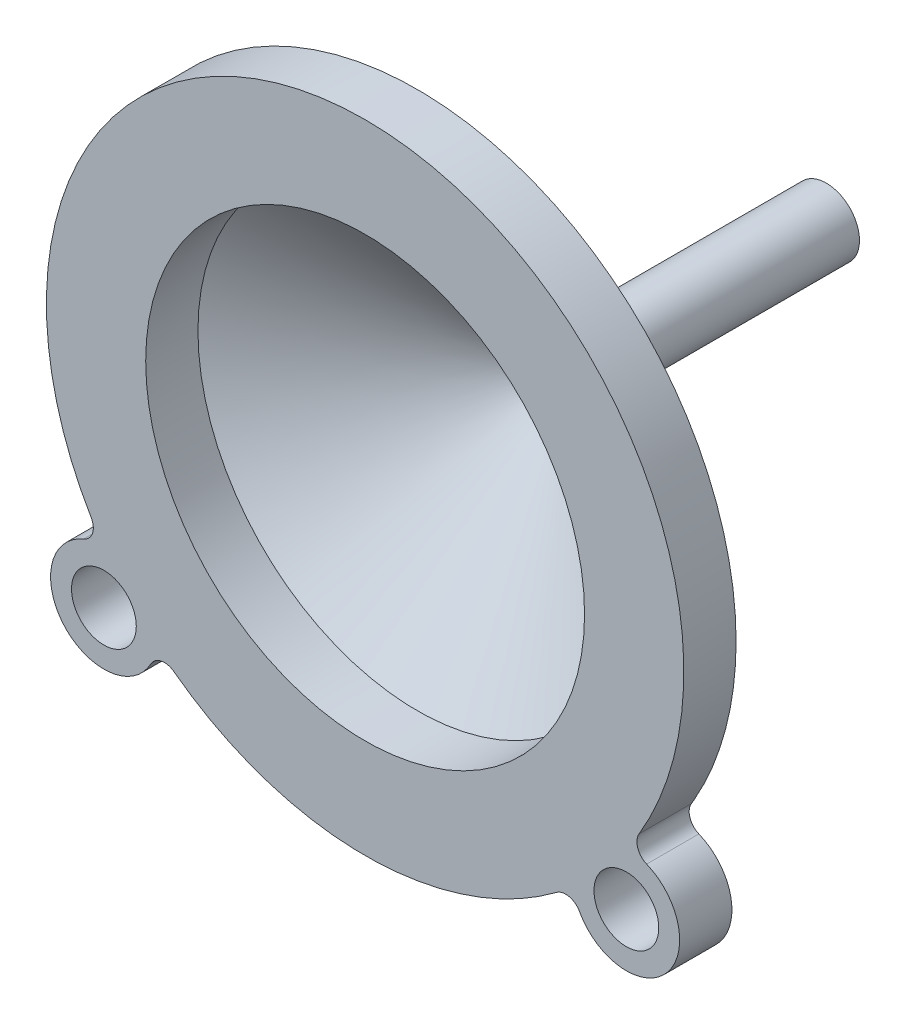
ISO-10303-21;
HEADER;
FILE_DESCRIPTION(('STEP AP214'),'2;1');
FILE_NAME('part.step','',(''),(''),'','','');
FILE_SCHEMA(('AUTOMOTIVE_DESIGN { 1 0 10303 214 1 1 1 1 }'));
ENDSEC;
DATA;
#1=APPLICATION_CONTEXT('core data for automotive mechanical design processes');
#2=APPLICATION_PROTOCOL_DEFINITION('international standard','automotive_design',2000,#1);
#3=PRODUCT_CONTEXT('',#1,'mechanical');
#4=PRODUCT('Part','Part','',(#3));
#5=PRODUCT_RELATED_PRODUCT_CATEGORY('part','',(#4));
#6=PRODUCT_DEFINITION_FORMATION('','',#4);
#7=PRODUCT_DEFINITION_CONTEXT('part definition',#1,'design');
#8=PRODUCT_DEFINITION('design','',#6,#7);
#9=PRODUCT_DEFINITION_SHAPE('','',#8);
#10=(LENGTH_UNIT() NAMED_UNIT(*) SI_UNIT(.MILLI.,.METRE.));
#11=(NAMED_UNIT(*) PLANE_ANGLE_UNIT() SI_UNIT($,.RADIAN.));
#12=(NAMED_UNIT(*) SI_UNIT($,.STERADIAN.) SOLID_ANGLE_UNIT());
#13=UNCERTAINTY_MEASURE_WITH_UNIT(LENGTH_MEASURE(1.E-05),#10,'distance_accuracy_value','');
#14=(GEOMETRIC_REPRESENTATION_CONTEXT(3) GLOBAL_UNCERTAINTY_ASSIGNED_CONTEXT((#13)) GLOBAL_UNIT_ASSIGNED_CONTEXT((#10,
#11,#12)) REPRESENTATION_CONTEXT('',''));
#15=CARTESIAN_POINT('',(0.,0.,0.));
#16=DIRECTION('',(0.,0.,1.));
#17=DIRECTION('',(1.,0.,0.));
#18=AXIS2_PLACEMENT_3D('',#15,#16,#17);
#19=CARTESIAN_POINT('',(0.,0.,0.));
#20=DIRECTION('',(0.,0.,1.));
#21=DIRECTION('',(1.,0.,0.));
#22=AXIS2_PLACEMENT_3D('',#19,#20,#21);
#23=CONICAL_SURFACE('',#22,30.5,0.959931088596887);
#24=CARTESIAN_POINT('',(0.,0.,-19.1331709815801));
#25=DIRECTION('',(0.,0.,1.));
#26=DIRECTION('',(1.,0.,0.));
#27=AXIS2_PLACEMENT_3D('',#24,#25,#26);
#28=CIRCLE('',#27,3.175);
#29=CARTESIAN_POINT('',(3.175,0.,-19.1331709815801));
#30=VERTEX_POINT('',#29);
#31=EDGE_CURVE('E250',#30,#30,#28,.T.);
#32=ORIENTED_EDGE('',*,*,#31,.T.);
#33=EDGE_LOOP('',(#32));
#34=FACE_BOUND('',#33,.T.);
#35=CARTESIAN_POINT('',(0.,0.,0.));
#36=DIRECTION('',(0.,0.,1.));
#37=DIRECTION('',(1.,0.,0.));
#38=AXIS2_PLACEMENT_3D('',#35,#36,#37);
#39=CIRCLE('',#38,30.5);
#40=CARTESIAN_POINT('',(26.4995327627771,-15.1004888448852,0.));
#41=VERTEX_POINT('',#40);
#42=CARTESIAN_POINT('',(-26.4995327627771,-15.1004888448852,0.));
#43=VERTEX_POINT('',#42);
#44=EDGE_CURVE('E168',#41,#43,#39,.T.);
#45=ORIENTED_EDGE('',*,*,#44,.F.);
#46=CARTESIAN_POINT('',(26.4998272637416,-15.1005489462847,0.000200000000201483));
#47=CARTESIAN_POINT('',(26.2850240876564,-15.0567281091826,-0.145650210075096));
#48=CARTESIAN_POINT('',(26.0672601542546,-15.0220758773172,-0.290002327123507));
#49=CARTESIAN_POINT('',(25.6264781094935,-14.9719627147964,-0.574579997651121));
#50=CARTESIAN_POINT('',(25.4034533552258,-14.9565275351551,-0.714799768784477));
#51=CARTESIAN_POINT('',(24.951355155761,-14.945776111692,-0.990831614164049));
#52=CARTESIAN_POINT('',(24.7222451866899,-14.9506437117276,-1.12659214294379));
#53=CARTESIAN_POINT('',(24.261383929305,-14.9819364274957,-1.39052435588818));
#54=CARTESIAN_POINT('',(24.029634242131,-15.0083490968273,-1.51870037571794));
#55=CARTESIAN_POINT('',(23.4393062520521,-15.1043041741347,-1.83217411909519));
#56=CARTESIAN_POINT('',(23.0795560324887,-15.1894033897269,-2.01111453674643));
#57=CARTESIAN_POINT('',(22.5437756836572,-15.3601847540177,-2.25547285967969));
#58=CARTESIAN_POINT('',(22.3660320607247,-15.4241990300531,-2.33283918406021));
#59=CARTESIAN_POINT('',(22.0127733503116,-15.5669969095608,-2.47839059279367));
#60=CARTESIAN_POINT('',(21.837256933656,-15.6457712144711,-2.54658141133876));
#61=CARTESIAN_POINT('',(21.5198864072392,-15.8034110929506,-2.66153468584702));
#62=CARTESIAN_POINT('',(21.3774555981291,-15.8799094608814,-2.70996385489075));
#63=CARTESIAN_POINT('',(21.0960638148033,-16.0431409492395,-2.79879742950449));
#64=CARTESIAN_POINT('',(20.9571011951627,-16.1298691000132,-2.83920570625494));
#65=CARTESIAN_POINT('',(20.6836138107222,-16.3134252639522,-2.91127298238221));
#66=CARTESIAN_POINT('',(20.5490894245904,-16.4102541359885,-2.94293123690217));
#67=CARTESIAN_POINT('',(20.2855993392861,-16.613634019509,-2.9968379366786));
#68=CARTESIAN_POINT('',(20.1566336877854,-16.7201851143467,-3.01908630125001));
#69=CARTESIAN_POINT('',(19.9048571036075,-16.9428856931411,-3.05374375209263));
#70=CARTESIAN_POINT('',(19.7820748158492,-17.0590742348716,-3.06611040123032));
#71=CARTESIAN_POINT('',(19.5443569449105,-17.2998229322145,-3.08054758658992));
#72=CARTESIAN_POINT('',(19.4294213603765,-17.4243830863828,-3.08261812458796));
#73=CARTESIAN_POINT('',(19.208375841638,-17.6808514935558,-3.07641240107073));
#74=CARTESIAN_POINT('',(19.1022657244338,-17.8127595941032,-3.06813635415332));
#75=CARTESIAN_POINT('',(18.8996622938164,-18.0827771527015,-3.04143918758293));
#76=CARTESIAN_POINT('',(18.8031687383776,-18.2208864545562,-3.02301832332675));
#77=CARTESIAN_POINT('',(18.6266879631594,-18.492378906676,-2.97807412708849));
#78=CARTESIAN_POINT('',(18.546020934701,-18.6254293726667,-2.95219849506285));
#79=CARTESIAN_POINT('',(18.3937627311907,-18.8949577009083,-2.89250926617391));
#80=CARTESIAN_POINT('',(18.3221749825849,-19.031436833968,-2.85869268610919));
#81=CARTESIAN_POINT('',(18.1882576489023,-19.3068245885662,-2.78372107001342));
#82=CARTESIAN_POINT('',(18.1259248893079,-19.4457323587088,-2.74256856095855));
#83=CARTESIAN_POINT('',(18.0104639437589,-19.7252211623261,-2.65354762165105));
#84=CARTESIAN_POINT('',(17.9573376679864,-19.8658025365932,-2.60567780139508));
#85=CARTESIAN_POINT('',(17.8432741016564,-20.1970116316961,-2.48614774965496));
#86=CARTESIAN_POINT('',(17.7860496765025,-20.3880349487107,-2.41200479811343));
#87=CARTESIAN_POINT('',(17.6876369317263,-20.7702565082064,-2.25426521334308));
#88=CARTESIAN_POINT('',(17.6464534277319,-20.9614547859717,-2.17066575088984));
#89=CARTESIAN_POINT('',(17.5458072177325,-21.5348541224989,-1.90722857393167));
#90=CARTESIAN_POINT('',(17.5096033951352,-21.9157986785606,-1.71514583207539));
#91=CARTESIAN_POINT('',(17.4971531432438,-22.5042905655387,-1.39641911784766));
#92=CARTESIAN_POINT('',(17.5018083598042,-22.7159043926207,-1.27718986418499));
#93=CARTESIAN_POINT('',(17.5284667904519,-23.1347453243432,-1.03281388349294));
#94=CARTESIAN_POINT('',(17.5504757133285,-23.3419709623765,-0.9076652219137));
#95=CARTESIAN_POINT('',(17.6107109539829,-23.7492208552776,-0.653937611320533));
#96=CARTESIAN_POINT('',(17.6487889628501,-23.9492932560904,-0.525399866926783));
#97=CARTESIAN_POINT('',(17.7403574599677,-24.3433618715242,-0.264926372431859));
#98=CARTESIAN_POINT('',(17.7938343842785,-24.5373632677023,-0.132993705435996));
#99=CARTESIAN_POINT('',(17.85465437173,-24.7280961813345,0.000199999999998498));
#100=B_SPLINE_CURVE_WITH_KNOTS('',3,(#46,#47,#48,#49,#50,#51,#52,#53,#54,#55,#56,#57,#58,#59,
#60,#61,#62,#63,#64,#65,#66,#67,#68,#69,#70,#71,#72,#73,#74,#75,#76,#77,#78,#79,#80,#81,#82,#83,
#84,#85,#86,#87,#88,#89,#90,#91,#92,#93,#94,#95,#96,#97,#98,#99),.UNSPECIFIED.,.F.,.F.,(4,2,2,2,
2,2,2,2,2,2,2,2,2,2,2,2,2,2,2,2,2,2,2,2,2,2,4),(0.,0.789837362021922,1.58073197767573,
2.37880370378232,3.17641471696137,4.40303186612537,5.01488762253738,5.62635920860469,
6.13218537839867,6.63776682091197,7.14339128844774,7.64902009137038,8.15680882480279,
8.66459747063981,9.17237558464,9.68014091585959,10.1528261809695,10.6256893061602,
11.0983898598539,11.5711883734177,12.2084768954693,12.8459565900422,14.1244305395881,
14.8526831001179,15.5811753313992,16.3030861557092,17.0243630290385),.UNSPECIFIED.);
#101=CARTESIAN_POINT('',(17.8545630422115,-24.7278098215692,0.));
#102=VERTEX_POINT('',#101);
#103=EDGE_CURVE('E11',#41,#102,#100,.T.);
#104=ORIENTED_EDGE('',*,*,#103,.T.);
#105=CARTESIAN_POINT('',(0.,0.,0.));
#106=DIRECTION('',(0.,0.,1.));
#107=DIRECTION('',(1.,0.,0.));
#108=AXIS2_PLACEMENT_3D('',#105,#106,#107);
#109=CIRCLE('',#108,30.5);
#110=CARTESIAN_POINT('',(-17.8545630422115,-24.7278098215692,0.));
#111=VERTEX_POINT('',#110);
#112=EDGE_CURVE('E152',#111,#102,#109,.T.);
#113=ORIENTED_EDGE('',*,*,#112,.F.);
#114=CARTESIAN_POINT('',(-17.85465437173,-24.7280961813345,0.000200000000000536));
#115=CARTESIAN_POINT('',(-17.7880562707248,-24.5192293262255,-0.145650210075289));
#116=CARTESIAN_POINT('',(-17.7302564932895,-24.306435779349,-0.290002327123695));
#117=CARTESIAN_POINT('',(-17.6331743009602,-23.8735672219621,-0.574579997651302));
#118=CARTESIAN_POINT('',(-17.5939167764405,-23.6534828459712,-0.714799768784654));
#119=CARTESIAN_POINT('',(-17.5347561949736,-23.2051432418023,-0.990831614164214));
#120=CARTESIAN_POINT('',(-17.5150320063468,-22.9768319896904,-1.12659214294394));
#121=CARTESIAN_POINT('',(-17.4967337015548,-22.5152721293687,-1.39052435588832));
#122=CARTESIAN_POINT('',(-17.4981473823938,-22.2820264474945,-1.51870037571808));
#123=CARTESIAN_POINT('',(-17.5302581152443,-21.6848134088161,-1.83217411909531));
#124=CARTESIAN_POINT('',(-17.5762966598493,-21.3180129870866,-2.01111453674654));
#125=CARTESIAN_POINT('',(-17.6886506362404,-20.7670107724158,-2.25547285967979));
#126=CARTESIAN_POINT('',(-17.7332393790101,-20.5834284555993,-2.33283918406031));
#127=CARTESIAN_POINT('',(-17.8373399911177,-20.216896037615,-2.47839059279375));
#128=CARTESIAN_POINT('',(-17.8968424729848,-20.033945611867,-2.54658141133883));
#129=CARTESIAN_POINT('',(-18.0195472404113,-19.701503252388,-2.66153468584708));
#130=CARTESIAN_POINT('',(-18.0803341348299,-19.5516917403245,-2.70996385489082));
#131=CARTESIAN_POINT('',(-18.2124556969263,-19.254421245078,-2.79879742950455));
#132=CARTESIAN_POINT('',(-18.2837852471834,-19.1069611587695,-2.83920570625499));
#133=CARTESIAN_POINT('',(-18.436961793377,-18.8153704173795,-2.91127298238225));
#134=CARTESIAN_POINT('',(-18.5188096838325,-18.671240046701,-2.94293123690221));
#135=CARTESIAN_POINT('',(-18.6927675332547,-18.3874636052918,-2.99683793667863));
#136=CARTESIAN_POINT('',(-18.7848775802056,-18.2478175730216,-3.01908630125004));
#137=CARTESIAN_POINT('',(-18.9793006083798,-17.9736156724971,-3.05374375209265));
#138=CARTESIAN_POINT('',(-19.0816554933761,-17.8390840965232,-3.06611040123033));
#139=CARTESIAN_POINT('',(-19.2955298976245,-17.5769248688708,-3.08054758658993));
#140=CARTESIAN_POINT('',(-19.4070494152956,-17.4492972160013,-3.08261812458796));
#141=CARTESIAN_POINT('',(-19.6383404258065,-17.2020288725177,-3.07641240107073));
#142=CARTESIAN_POINT('',(-19.7581117474474,-17.0823880163042,-3.06813635415331));
#143=CARTESIAN_POINT('',(-20.0048510568896,-16.8520028057864,-3.04143918758292));
#144=CARTESIAN_POINT('',(-20.1318188634464,-16.7412582275979,-3.02301832332674));
#145=CARTESIAN_POINT('',(-20.3828252721508,-16.5366869726059,-2.97807412708847));
#146=CARTESIAN_POINT('',(-20.5064602228004,-16.4422200738608,-2.95219849506282));
#147=CARTESIAN_POINT('',(-20.7581108208339,-16.2619423526352,-2.89250926617388));
#148=CARTESIAN_POINT('',(-20.8861280990638,-16.1761348006028,-2.85869268610916));
#149=CARTESIAN_POINT('',(-21.1455707425658,-16.0134640214935,-2.78372107001338));
#150=CARTESIAN_POINT('',(-21.2769949209975,-15.9365977294784,-2.74256856095851));
#151=CARTESIAN_POINT('',(-21.5424937530691,-15.7918372671168,-2.65354762165101));
#152=CARTESIAN_POINT('',(-21.6765689503347,-15.7239449594047,-2.60567780139503));
#153=CARTESIAN_POINT('',(-21.9936397762192,-15.5750286969759,-2.48614774965491));
#154=CARTESIAN_POINT('',(-22.1774267909068,-15.4976537933596,-2.41200479811338));
#155=CARTESIAN_POINT('',(-22.5468940279874,-15.3588289050947,-2.25426521334301));
#156=CARTESIAN_POINT('',(-22.7325748017624,-15.2973837045336,-2.17066575088976));
#157=CARTESIAN_POINT('',(-23.2918784085553,-15.1358413443133,-1.90722857393158));
#158=CARTESIAN_POINT('',(-23.6667456527436,-15.0590037181241,-1.7151458320753));
#159=CARTESIAN_POINT('',(-24.2505106331409,-14.9835308258184,-1.39641911784756));
#160=CARTESIAN_POINT('',(-24.4614038206496,-14.965471304343,-1.27718986418488));
#161=CARTESIAN_POINT('',(-24.8806887016342,-14.9470705818424,-1.03281388349281));
#162=CARTESIAN_POINT('',(-25.0890795490169,-14.9467352139414,-0.907665221913559));
#163=CARTESIAN_POINT('',(-25.5004400966251,-14.9629604830039,-0.653937611320374));
#164=CARTESIAN_POINT('',(-25.7034417645324,-14.9793685040039,-0.525399866926614));
#165=CARTESIAN_POINT('',(-26.1050563665392,-15.0281596383334,-0.26492637243167));
#166=CARTESIAN_POINT('',(-26.303672998089,-15.060528710372,-0.132993705435799));
#167=CARTESIAN_POINT('',(-26.4998272637416,-15.1005489462847,0.000200000000201425));
#168=B_SPLINE_CURVE_WITH_KNOTS('',3,(#114,#115,#116,#117,#118,#119,#120,#121,#122,#123,#124,
#125,#126,#127,#128,#129,#130,#131,#132,#133,#134,#135,#136,#137,#138,#139,#140,#141,#142,#143,
#144,#145,#146,#147,#148,#149,#150,#151,#152,#153,#154,#155,#156,#157,#158,#159,#160,#161,#162,
#163,#164,#165,#166,#167),.UNSPECIFIED.,.F.,.F.,(4,2,2,2,2,2,2,2,2,2,2,2,2,2,2,2,2,2,2,2,2,2,2,
2,2,2,4),(0.,0.789837362021904,1.58073197767569,2.37880370378226,3.17641471696128,
4.40303186612525,5.01488762253726,5.62635920860456,6.13218537839853,6.63776682091182,
7.14339128844758,7.64902009137021,8.15680882480263,8.66459747063963,9.17237558463982,
9.68014091585939,10.1528261809693,10.62568930616,11.0983898598537,11.5711883734175,
12.2084768954692,12.8459565900421,14.1244305395879,14.8526831001178,15.5811753313992,
16.3030861557092,17.0243630290385),.UNSPECIFIED.);
#169=EDGE_CURVE('E53',#111,#43,#168,.T.);
#170=ORIENTED_EDGE('',*,*,#169,.T.);
#171=EDGE_LOOP('',(#45,#104,#113,#170));
#172=FACE_BOUND('',#171,.T.);
#173=ADVANCED_FACE('F38',(#34,#172),#23,.T.);
#174=CARTESIAN_POINT('',(9.60025923141054,-12.7998055723404,0.));
#175=DIRECTION('',(0.,0.,1.));
#176=DIRECTION('',(1.,0.,0.));
#177=AXIS2_PLACEMENT_3D('',#174,#175,#176);
#178=PLANE('',#177);
#179=CARTESIAN_POINT('',(-25.,-22.4490534321606,0.));
#180=DIRECTION('',(0.,0.,1.));
#181=DIRECTION('',(1.,0.,0.));
#182=AXIS2_PLACEMENT_3D('',#179,#180,#181);
#183=CIRCLE('',#182,3.1);
#184=CARTESIAN_POINT('',(-21.9,-22.4490534321606,0.));
#185=VERTEX_POINT('',#184);
#186=EDGE_CURVE('E339',#185,#185,#183,.T.);
#187=ORIENTED_EDGE('',*,*,#186,.T.);
#188=EDGE_LOOP('',(#187));
#189=FACE_BOUND('',#188,.T.);
#190=CARTESIAN_POINT('',(-27.5106139067934,-16.3452171130072,0.));
#191=DIRECTION('',(0.,0.,-1.));
#192=DIRECTION('',(1.,0.,0.));
#193=AXIS2_PLACEMENT_3D('',#190,#191,#192);
#194=CIRCLE('',#193,1.5);
#195=CARTESIAN_POINT('',(-26.2210538799125,-15.579035060835,0.));
#196=VERTEX_POINT('',#195);
#197=CARTESIAN_POINT('',(-26.9400198370677,-17.7324526400875,0.));
#198=VERTEX_POINT('',#197);
#199=EDGE_CURVE('E134',#196,#198,#194,.T.);
#200=ORIENTED_EDGE('',*,*,#199,.F.);
#201=EDGE_CURVE('E163',#43,#196,#39,.T.);
#202=ORIENTED_EDGE('',*,*,#201,.F.);
#203=CARTESIAN_POINT('',(-25.,-22.4490534321606,0.));
#204=DIRECTION('',(0.,0.,-1.));
#205=DIRECTION('',(-1.,0.,0.));
#206=AXIS2_PLACEMENT_3D('',#203,#204,#205);
#207=CIRCLE('',#206,7.5);
#208=EDGE_CURVE('E320',#43,#111,#207,.T.);
#209=ORIENTED_EDGE('',*,*,#208,.T.);
#210=CARTESIAN_POINT('',(-18.3004941598763,-24.3996293722739,0.));
#211=VERTEX_POINT('',#210);
#212=EDGE_CURVE('E147',#211,#111,#109,.T.);
#213=ORIENTED_EDGE('',*,*,#212,.F.);
#214=CARTESIAN_POINT('',(-19.2005184628211,-25.5996111446808,0.));
#215=DIRECTION('',(0.,0.,-1.));
#216=DIRECTION('',(1.,0.,0.));
#217=AXIS2_PLACEMENT_3D('',#214,#215,#216);
#218=CIRCLE('',#217,1.5);
#219=CARTESIAN_POINT('',(-20.5185824485436,-24.8835753009262,0.));
#220=VERTEX_POINT('',#219);
#221=EDGE_CURVE('E173',#220,#211,#218,.T.);
#222=ORIENTED_EDGE('',*,*,#221,.F.);
#223=CARTESIAN_POINT('',(-25.,-22.4490534321606,0.));
#224=DIRECTION('',(0.,0.,1.));
#225=DIRECTION('',(1.,0.,0.));
#226=AXIS2_PLACEMENT_3D('',#223,#224,#225);
#227=CIRCLE('',#226,5.1);
#228=EDGE_CURVE('E94',#198,#220,#227,.T.);
#229=ORIENTED_EDGE('',*,*,#228,.F.);
#230=EDGE_LOOP('',(#200,#202,#209,#213,#222,#229));
#231=FACE_BOUND('',#230,.T.);
#232=ADVANCED_FACE('F239',(#189,#231),#178,.F.);
#233=CARTESIAN_POINT('',(9.60025923141054,-12.7998055723404,5.));
#234=DIRECTION('',(0.,0.,1.));
#235=DIRECTION('',(1.,0.,0.));
#236=AXIS2_PLACEMENT_3D('',#233,#234,#235);
#237=PLANE('',#236);
#238=CARTESIAN_POINT('',(25.,-22.4490534321606,5.));
#239=DIRECTION('',(0.,0.,1.));
#240=DIRECTION('',(1.,0.,0.));
#241=AXIS2_PLACEMENT_3D('',#238,#239,#240);
#242=CIRCLE('',#241,3.1);
#243=CARTESIAN_POINT('',(28.1,-22.4490534321606,5.));
#244=VERTEX_POINT('',#243);
#245=EDGE_CURVE('E291',#244,#244,#242,.T.);
#246=ORIENTED_EDGE('',*,*,#245,.F.);
#247=EDGE_LOOP('',(#246));
#248=FACE_BOUND('',#247,.T.);
#249=CARTESIAN_POINT('',(0.,0.,5.));
#250=DIRECTION('',(0.,0.,1.));
#251=DIRECTION('',(1.,0.,0.));
#252=AXIS2_PLACEMENT_3D('',#249,#250,#251);
#253=CIRCLE('',#252,30.5);
#254=CARTESIAN_POINT('',(-18.3004941598763,-24.3996293722739,5.));
#255=VERTEX_POINT('',#254);
#256=CARTESIAN_POINT('',(18.3004941598763,-24.3996293722739,5.));
#257=VERTEX_POINT('',#256);
#258=EDGE_CURVE('E177',#255,#257,#253,.T.);
#259=ORIENTED_EDGE('',*,*,#258,.T.);
#260=CARTESIAN_POINT('',(19.2005184628211,-25.5996111446808,5.));
#261=DIRECTION('',(0.,0.,-1.));
#262=DIRECTION('',(1.,0.,0.));
#263=AXIS2_PLACEMENT_3D('',#260,#261,#262);
#264=CIRCLE('',#263,1.5);
#265=CARTESIAN_POINT('',(20.5185824485436,-24.8835753009262,5.));
#266=VERTEX_POINT('',#265);
#267=EDGE_CURVE('E103',#257,#266,#264,.T.);
#268=ORIENTED_EDGE('',*,*,#267,.T.);
#269=CARTESIAN_POINT('',(25.,-22.4490534321606,5.));
#270=DIRECTION('',(0.,0.,1.));
#271=DIRECTION('',(1.,0.,0.));
#272=AXIS2_PLACEMENT_3D('',#269,#270,#271);
#273=CIRCLE('',#272,5.1);
#274=CARTESIAN_POINT('',(26.9400198370677,-17.7324526400875,5.));
#275=VERTEX_POINT('',#274);
#276=EDGE_CURVE('E274',#266,#275,#273,.T.);
#277=ORIENTED_EDGE('',*,*,#276,.T.);
#278=CARTESIAN_POINT('',(27.5106139067934,-16.3452171130072,5.));
#279=DIRECTION('',(0.,0.,-1.));
#280=DIRECTION('',(1.,0.,0.));
#281=AXIS2_PLACEMENT_3D('',#278,#279,#280);
#282=CIRCLE('',#281,1.5);
#283=CARTESIAN_POINT('',(26.2210538799125,-15.579035060835,5.));
#284=VERTEX_POINT('',#283);
#285=EDGE_CURVE('E270',#275,#284,#282,.T.);
#286=ORIENTED_EDGE('',*,*,#285,.T.);
#287=CARTESIAN_POINT('',(0.,0.,5.));
#288=DIRECTION('',(0.,0.,1.));
#289=DIRECTION('',(1.,0.,0.));
#290=AXIS2_PLACEMENT_3D('',#287,#288,#289);
#291=CIRCLE('',#290,30.5);
#292=CARTESIAN_POINT('',(-26.2210538799125,-15.579035060835,5.));
#293=VERTEX_POINT('',#292);
#294=EDGE_CURVE('E125',#284,#293,#291,.T.);
#295=ORIENTED_EDGE('',*,*,#294,.T.);
#296=CARTESIAN_POINT('',(-27.5106139067934,-16.3452171130072,5.));
#297=DIRECTION('',(0.,0.,-1.));
#298=DIRECTION('',(1.,0.,0.));
#299=AXIS2_PLACEMENT_3D('',#296,#297,#298);
#300=CIRCLE('',#299,1.5);
#301=CARTESIAN_POINT('',(-26.9400198370677,-17.7324526400875,5.));
#302=VERTEX_POINT('',#301);
#303=EDGE_CURVE('E118',#293,#302,#300,.T.);
#304=ORIENTED_EDGE('',*,*,#303,.T.);
#305=CARTESIAN_POINT('',(-25.,-22.4490534321606,5.));
#306=DIRECTION('',(0.,0.,1.));
#307=DIRECTION('',(1.,0.,0.));
#308=AXIS2_PLACEMENT_3D('',#305,#306,#307);
#309=CIRCLE('',#308,5.1);
#310=CARTESIAN_POINT('',(-20.5185824485436,-24.8835753009262,5.));
#311=VERTEX_POINT('',#310);
#312=EDGE_CURVE('E123',#302,#311,#309,.T.);
#313=ORIENTED_EDGE('',*,*,#312,.T.);
#314=CARTESIAN_POINT('',(-19.2005184628211,-25.5996111446808,5.));
#315=DIRECTION('',(0.,0.,-1.));
#316=DIRECTION('',(1.,0.,0.));
#317=AXIS2_PLACEMENT_3D('',#314,#315,#316);
#318=CIRCLE('',#317,1.5);
#319=EDGE_CURVE('E69',#311,#255,#318,.T.);
#320=ORIENTED_EDGE('',*,*,#319,.T.);
#321=EDGE_LOOP('',(#259,#268,#277,#286,#295,#304,#313,#320));
#322=FACE_BOUND('',#321,.T.);
#323=CARTESIAN_POINT('',(0.,0.,5.));
#324=DIRECTION('',(0.,0.,1.));
#325=DIRECTION('',(1.,0.,0.));
#326=AXIS2_PLACEMENT_3D('',#323,#324,#325);
#327=CIRCLE('',#326,21.);
#328=CARTESIAN_POINT('',(21.,0.,5.));
#329=VERTEX_POINT('',#328);
#330=EDGE_CURVE('E281',#329,#329,#327,.T.);
#331=ORIENTED_EDGE('',*,*,#330,.F.);
#332=EDGE_LOOP('',(#331));
#333=FACE_BOUND('',#332,.T.);
#334=CARTESIAN_POINT('',(-25.,-22.4490534321606,5.));
#335=DIRECTION('',(0.,0.,1.));
#336=DIRECTION('',(1.,0.,0.));
#337=AXIS2_PLACEMENT_3D('',#334,#335,#336);
#338=CIRCLE('',#337,3.1);
#339=CARTESIAN_POINT('',(-21.9,-22.4490534321606,5.));
#340=VERTEX_POINT('',#339);
#341=EDGE_CURVE('E340',#340,#340,#338,.T.);
#342=ORIENTED_EDGE('',*,*,#341,.F.);
#343=EDGE_LOOP('',(#342));
#344=FACE_BOUND('',#343,.T.);
#345=ADVANCED_FACE('F120',(#248,#322,#333,#344),#237,.T.);
#346=CARTESIAN_POINT('',(25.,-22.4490534321606,0.));
#347=DIRECTION('',(0.,0.,1.));
#348=DIRECTION('',(1.,0.,0.));
#349=AXIS2_PLACEMENT_3D('',#346,#347,#348);
#350=CIRCLE('',#349,3.1);
#351=CARTESIAN_POINT('',(28.1,-22.4490534321606,0.));
#352=VERTEX_POINT('',#351);
#353=EDGE_CURVE('E294',#352,#352,#350,.T.);
#354=ORIENTED_EDGE('',*,*,#353,.T.);
#355=EDGE_LOOP('',(#354));
#356=FACE_BOUND('',#355,.T.);
#357=CARTESIAN_POINT('',(19.2005184628211,-25.5996111446808,0.));
#358=DIRECTION('',(0.,0.,-1.));
#359=DIRECTION('',(1.,0.,0.));
#360=AXIS2_PLACEMENT_3D('',#357,#358,#359);
#361=CIRCLE('',#360,1.5);
#362=CARTESIAN_POINT('',(18.3004941598763,-24.3996293722739,0.));
#363=VERTEX_POINT('',#362);
#364=CARTESIAN_POINT('',(20.5185824485436,-24.8835753009262,0.));
#365=VERTEX_POINT('',#364);
#366=EDGE_CURVE('E151',#363,#365,#361,.T.);
#367=ORIENTED_EDGE('',*,*,#366,.F.);
#368=EDGE_CURVE('E153',#102,#363,#109,.T.);
#369=ORIENTED_EDGE('',*,*,#368,.F.);
#370=CARTESIAN_POINT('',(25.,-22.4490534321606,0.));
#371=DIRECTION('',(0.,0.,-1.));
#372=DIRECTION('',(-1.,0.,0.));
#373=AXIS2_PLACEMENT_3D('',#370,#371,#372);
#374=CIRCLE('',#373,7.5);
#375=EDGE_CURVE('E60',#102,#41,#374,.T.);
#376=ORIENTED_EDGE('',*,*,#375,.T.);
#377=CARTESIAN_POINT('',(26.2210538799125,-15.579035060835,0.));
#378=VERTEX_POINT('',#377);
#379=EDGE_CURVE('E164',#378,#41,#39,.T.);
#380=ORIENTED_EDGE('',*,*,#379,.F.);
#381=CARTESIAN_POINT('',(27.5106139067934,-16.3452171130072,0.));
#382=DIRECTION('',(0.,0.,-1.));
#383=DIRECTION('',(1.,0.,0.));
#384=AXIS2_PLACEMENT_3D('',#381,#382,#383);
#385=CIRCLE('',#384,1.5);
#386=CARTESIAN_POINT('',(26.9400198370677,-17.7324526400875,0.));
#387=VERTEX_POINT('',#386);
#388=EDGE_CURVE('E159',#387,#378,#385,.T.);
#389=ORIENTED_EDGE('',*,*,#388,.F.);
#390=CARTESIAN_POINT('',(25.,-22.4490534321606,0.));
#391=DIRECTION('',(0.,0.,1.));
#392=DIRECTION('',(1.,0.,0.));
#393=AXIS2_PLACEMENT_3D('',#390,#391,#392);
#394=CIRCLE('',#393,5.1);
#395=EDGE_CURVE('E156',#365,#387,#394,.T.);
#396=ORIENTED_EDGE('',*,*,#395,.F.);
#397=EDGE_LOOP('',(#367,#369,#376,#380,#389,#396));
#398=FACE_BOUND('',#397,.T.);
#399=ADVANCED_FACE('F246',(#356,#398),#178,.F.);
#400=CARTESIAN_POINT('',(0.,0.,5.));
#401=DIRECTION('',(0.,0.,-1.));
#402=DIRECTION('',(-1.,0.,0.));
#403=AXIS2_PLACEMENT_3D('',#400,#401,#402);
#404=CYLINDRICAL_SURFACE('',#403,30.5);
#405=ORIENTED_EDGE('',*,*,#212,.T.);
#406=ORIENTED_EDGE('',*,*,#112,.T.);
#407=ORIENTED_EDGE('',*,*,#368,.T.);
#408=DIRECTION('',(0.,0.,-1.));
#409=VECTOR('',#408,1.);
#410=CARTESIAN_POINT('',(18.3004941598763,-24.3996293722739,5.));
#411=LINE('',#410,#409);
#412=EDGE_CURVE('E197',#257,#363,#411,.T.);
#413=ORIENTED_EDGE('',*,*,#412,.F.);
#414=ORIENTED_EDGE('',*,*,#258,.F.);
#415=DIRECTION('',(0.,0.,-1.));
#416=VECTOR('',#415,1.);
#417=CARTESIAN_POINT('',(-18.3004941598763,-24.3996293722739,5.));
#418=LINE('',#417,#416);
#419=EDGE_CURVE('E143',#255,#211,#418,.T.);
#420=ORIENTED_EDGE('',*,*,#419,.T.);
#421=EDGE_LOOP('',(#405,#406,#407,#413,#414,#420));
#422=FACE_BOUND('',#421,.T.);
#423=ADVANCED_FACE('F40',(#422),#404,.T.);
#424=CARTESIAN_POINT('',(19.2005184628211,-25.5996111446808,5.));
#425=DIRECTION('',(0.,0.,-1.));
#426=DIRECTION('',(-1.,0.,0.));
#427=AXIS2_PLACEMENT_3D('',#424,#425,#426);
#428=CYLINDRICAL_SURFACE('',#427,1.5);
#429=ORIENTED_EDGE('',*,*,#366,.T.);
#430=DIRECTION('',(0.,0.,-1.));
#431=VECTOR('',#430,1.);
#432=CARTESIAN_POINT('',(20.5185824485436,-24.8835753009262,5.));
#433=LINE('',#432,#431);
#434=EDGE_CURVE('E193',#266,#365,#433,.T.);
#435=ORIENTED_EDGE('',*,*,#434,.F.);
#436=ORIENTED_EDGE('',*,*,#267,.F.);
#437=ORIENTED_EDGE('',*,*,#412,.T.);
#438=EDGE_LOOP('',(#429,#435,#436,#437));
#439=FACE_BOUND('',#438,.T.);
#440=ADVANCED_FACE('F277',(#439),#428,.F.);
#441=CARTESIAN_POINT('',(25.,-22.4490534321606,5.));
#442=DIRECTION('',(0.,0.,-1.));
#443=DIRECTION('',(-1.,0.,0.));
#444=AXIS2_PLACEMENT_3D('',#441,#442,#443);
#445=CYLINDRICAL_SURFACE('',#444,5.1);
#446=ORIENTED_EDGE('',*,*,#395,.T.);
#447=DIRECTION('',(0.,0.,-1.));
#448=VECTOR('',#447,1.);
#449=CARTESIAN_POINT('',(26.9400198370677,-17.7324526400875,5.));
#450=LINE('',#449,#448);
#451=EDGE_CURVE('E189',#275,#387,#450,.T.);
#452=ORIENTED_EDGE('',*,*,#451,.F.);
#453=ORIENTED_EDGE('',*,*,#276,.F.);
#454=ORIENTED_EDGE('',*,*,#434,.T.);
#455=EDGE_LOOP('',(#446,#452,#453,#454));
#456=FACE_BOUND('',#455,.T.);
#457=ADVANCED_FACE('F273',(#456),#445,.T.);
#458=CARTESIAN_POINT('',(27.5106139067934,-16.3452171130072,5.));
#459=DIRECTION('',(0.,0.,-1.));
#460=DIRECTION('',(-1.,0.,0.));
#461=AXIS2_PLACEMENT_3D('',#458,#459,#460);
#462=CYLINDRICAL_SURFACE('',#461,1.5);
#463=ORIENTED_EDGE('',*,*,#388,.T.);
#464=DIRECTION('',(0.,0.,-1.));
#465=VECTOR('',#464,1.);
#466=CARTESIAN_POINT('',(26.2210538799125,-15.579035060835,5.));
#467=LINE('',#466,#465);
#468=EDGE_CURVE('E185',#284,#378,#467,.T.);
#469=ORIENTED_EDGE('',*,*,#468,.F.);
#470=ORIENTED_EDGE('',*,*,#285,.F.);
#471=ORIENTED_EDGE('',*,*,#451,.T.);
#472=EDGE_LOOP('',(#463,#469,#470,#471));
#473=FACE_BOUND('',#472,.T.);
#474=ADVANCED_FACE('F267',(#473),#462,.F.);
#475=CARTESIAN_POINT('',(0.,0.,5.));
#476=DIRECTION('',(0.,0.,-1.));
#477=DIRECTION('',(-1.,0.,0.));
#478=AXIS2_PLACEMENT_3D('',#475,#476,#477);
#479=CYLINDRICAL_SURFACE('',#478,30.5);
#480=ORIENTED_EDGE('',*,*,#379,.T.);
#481=ORIENTED_EDGE('',*,*,#44,.T.);
#482=ORIENTED_EDGE('',*,*,#201,.T.);
#483=DIRECTION('',(0.,0.,-1.));
#484=VECTOR('',#483,1.);
#485=CARTESIAN_POINT('',(-26.2210538799125,-15.579035060835,5.));
#486=LINE('',#485,#484);
#487=EDGE_CURVE('E136',#293,#196,#486,.T.);
#488=ORIENTED_EDGE('',*,*,#487,.F.);
#489=ORIENTED_EDGE('',*,*,#294,.F.);
#490=ORIENTED_EDGE('',*,*,#468,.T.);
#491=EDGE_LOOP('',(#480,#481,#482,#488,#489,#490));
#492=FACE_BOUND('',#491,.T.);
#493=ADVANCED_FACE('F260',(#492),#479,.T.);
#494=CARTESIAN_POINT('',(-27.5106139067934,-16.3452171130072,5.));
#495=DIRECTION('',(0.,0.,-1.));
#496=DIRECTION('',(-1.,0.,0.));
#497=AXIS2_PLACEMENT_3D('',#494,#495,#496);
#498=CYLINDRICAL_SURFACE('',#497,1.5);
#499=ORIENTED_EDGE('',*,*,#199,.T.);
#500=DIRECTION('',(0.,0.,-1.));
#501=VECTOR('',#500,1.);
#502=CARTESIAN_POINT('',(-26.9400198370677,-17.7324526400875,5.));
#503=LINE('',#502,#501);
#504=EDGE_CURVE('E131',#302,#198,#503,.T.);
#505=ORIENTED_EDGE('',*,*,#504,.F.);
#506=ORIENTED_EDGE('',*,*,#303,.F.);
#507=ORIENTED_EDGE('',*,*,#487,.T.);
#508=EDGE_LOOP('',(#499,#505,#506,#507));
#509=FACE_BOUND('',#508,.T.);
#510=ADVANCED_FACE('F132',(#509),#498,.F.);
#511=CARTESIAN_POINT('',(-25.,-22.4490534321606,5.));
#512=DIRECTION('',(0.,0.,-1.));
#513=DIRECTION('',(-1.,0.,0.));
#514=AXIS2_PLACEMENT_3D('',#511,#512,#513);
#515=CYLINDRICAL_SURFACE('',#514,5.1);
#516=ORIENTED_EDGE('',*,*,#228,.T.);
#517=DIRECTION('',(0.,0.,-1.));
#518=VECTOR('',#517,1.);
#519=CARTESIAN_POINT('',(-20.5185824485436,-24.8835753009262,5.));
#520=LINE('',#519,#518);
#521=EDGE_CURVE('E137',#311,#220,#520,.T.);
#522=ORIENTED_EDGE('',*,*,#521,.F.);
#523=ORIENTED_EDGE('',*,*,#312,.F.);
#524=ORIENTED_EDGE('',*,*,#504,.T.);
#525=EDGE_LOOP('',(#516,#522,#523,#524));
#526=FACE_BOUND('',#525,.T.);
#527=ADVANCED_FACE('F139',(#526),#515,.T.);
#528=CARTESIAN_POINT('',(-19.2005184628211,-25.5996111446808,5.));
#529=DIRECTION('',(0.,0.,-1.));
#530=DIRECTION('',(-1.,0.,0.));
#531=AXIS2_PLACEMENT_3D('',#528,#529,#530);
#532=CYLINDRICAL_SURFACE('',#531,1.5);
#533=ORIENTED_EDGE('',*,*,#221,.T.);
#534=ORIENTED_EDGE('',*,*,#419,.F.);
#535=ORIENTED_EDGE('',*,*,#319,.F.);
#536=ORIENTED_EDGE('',*,*,#521,.T.);
#537=EDGE_LOOP('',(#533,#534,#535,#536));
#538=FACE_BOUND('',#537,.T.);
#539=ADVANCED_FACE('F314',(#538),#532,.F.);
#540=CARTESIAN_POINT('',(0.,0.,5.));
#541=DIRECTION('',(0.,0.,-1.));
#542=DIRECTION('',(-1.,0.,0.));
#543=AXIS2_PLACEMENT_3D('',#540,#541,#542);
#544=CYLINDRICAL_SURFACE('',#543,21.);
#545=ORIENTED_EDGE('',*,*,#330,.T.);
#546=EDGE_LOOP('',(#545));
#547=FACE_BOUND('',#546,.T.);
#548=CARTESIAN_POINT('',(0.,0.,0.));
#549=DIRECTION('',(0.,0.,1.));
#550=DIRECTION('',(1.,0.,0.));
#551=AXIS2_PLACEMENT_3D('',#548,#549,#550);
#552=CIRCLE('',#551,21.);
#553=CARTESIAN_POINT('',(21.,0.,0.));
#554=VERTEX_POINT('',#553);
#555=EDGE_CURVE('E285',#554,#554,#552,.T.);
#556=ORIENTED_EDGE('',*,*,#555,.F.);
#557=EDGE_LOOP('',(#556));
#558=FACE_BOUND('',#557,.T.);
#559=ADVANCED_FACE('F356',(#547,#558),#544,.F.);
#560=CARTESIAN_POINT('',(25.,-22.4490534321606,5.));
#561=DIRECTION('',(0.,0.,-1.));
#562=DIRECTION('',(-1.,0.,0.));
#563=AXIS2_PLACEMENT_3D('',#560,#561,#562);
#564=CYLINDRICAL_SURFACE('',#563,3.1);
#565=ORIENTED_EDGE('',*,*,#245,.T.);
#566=EDGE_LOOP('',(#565));
#567=FACE_BOUND('',#566,.T.);
#568=ORIENTED_EDGE('',*,*,#353,.F.);
#569=EDGE_LOOP('',(#568));
#570=FACE_BOUND('',#569,.T.);
#571=ADVANCED_FACE('F234',(#567,#570),#564,.F.);
#572=CARTESIAN_POINT('',(-25.,-22.4490534321606,5.));
#573=DIRECTION('',(0.,0.,-1.));
#574=DIRECTION('',(-1.,0.,0.));
#575=AXIS2_PLACEMENT_3D('',#572,#573,#574);
#576=CYLINDRICAL_SURFACE('',#575,3.1);
#577=ORIENTED_EDGE('',*,*,#341,.T.);
#578=EDGE_LOOP('',(#577));
#579=FACE_BOUND('',#578,.T.);
#580=ORIENTED_EDGE('',*,*,#186,.F.);
#581=EDGE_LOOP('',(#580));
#582=FACE_BOUND('',#581,.T.);
#583=ADVANCED_FACE('F229',(#579,#582),#576,.F.);
#584=CARTESIAN_POINT('',(0.,0.,0.));
#585=DIRECTION('',(0.,0.,1.));
#586=DIRECTION('',(1.,0.,0.));
#587=AXIS2_PLACEMENT_3D('',#584,#585,#586);
#588=CYLINDRICAL_SURFACE('',#587,3.175);
#589=CARTESIAN_POINT('',(0.,0.,-39.1331709815801));
#590=DIRECTION('',(0.,0.,1.));
#591=DIRECTION('',(1.,0.,0.));
#592=AXIS2_PLACEMENT_3D('',#589,#590,#591);
#593=CIRCLE('',#592,3.175);
#594=CARTESIAN_POINT('',(3.175,0.,-39.1331709815801));
#595=VERTEX_POINT('',#594);
#596=EDGE_CURVE('E334',#595,#595,#593,.T.);
#597=ORIENTED_EDGE('',*,*,#596,.T.);
#598=EDGE_LOOP('',(#597));
#599=FACE_BOUND('',#598,.T.);
#600=ORIENTED_EDGE('',*,*,#31,.F.);
#601=EDGE_LOOP('',(#600));
#602=FACE_BOUND('',#601,.T.);
#603=ADVANCED_FACE('F226',(#599,#602),#588,.T.);
#604=CARTESIAN_POINT('',(3.175,0.,-39.1331709815801));
#605=DIRECTION('',(0.,0.,-1.));
#606=DIRECTION('',(-1.,0.,0.));
#607=AXIS2_PLACEMENT_3D('',#604,#605,#606);
#608=PLANE('',#607);
#609=CARTESIAN_POINT('',(0.,0.,-39.1331709815801));
#610=DIRECTION('',(0.,0.,1.));
#611=DIRECTION('',(1.,0.,0.));
#612=AXIS2_PLACEMENT_3D('',#609,#610,#611);
#613=CIRCLE('',#612,1.675);
#614=CARTESIAN_POINT('',(1.675,0.,-39.1331709815801));
#615=VERTEX_POINT('',#614);
#616=EDGE_CURVE('E330',#615,#615,#613,.T.);
#617=ORIENTED_EDGE('',*,*,#616,.T.);
#618=EDGE_LOOP('',(#617));
#619=FACE_BOUND('',#618,.T.);
#620=ORIENTED_EDGE('',*,*,#596,.F.);
#621=EDGE_LOOP('',(#620));
#622=FACE_BOUND('',#621,.T.);
#623=ADVANCED_FACE('F223',(#619,#622),#608,.T.);
#624=CARTESIAN_POINT('',(0.,0.,0.));
#625=DIRECTION('',(0.,0.,1.));
#626=DIRECTION('',(1.,0.,0.));
#627=AXIS2_PLACEMENT_3D('',#624,#625,#626);
#628=CYLINDRICAL_SURFACE('',#627,1.675);
#629=CARTESIAN_POINT('',(0.,0.,-13.5315106759025));
#630=DIRECTION('',(0.,0.,1.));
#631=DIRECTION('',(1.,0.,0.));
#632=AXIS2_PLACEMENT_3D('',#629,#630,#631);
#633=CIRCLE('',#632,1.675);
#634=CARTESIAN_POINT('',(1.675,0.,-13.5315106759025));
#635=VERTEX_POINT('',#634);
#636=EDGE_CURVE('E324',#635,#635,#633,.T.);
#637=ORIENTED_EDGE('',*,*,#636,.T.);
#638=EDGE_LOOP('',(#637));
#639=FACE_BOUND('',#638,.T.);
#640=ORIENTED_EDGE('',*,*,#616,.F.);
#641=EDGE_LOOP('',(#640));
#642=FACE_BOUND('',#641,.T.);
#643=ADVANCED_FACE('F219',(#639,#642),#628,.F.);
#644=CARTESIAN_POINT('',(0.,0.,-13.5315106759025));
#645=DIRECTION('',(0.,0.,1.));
#646=DIRECTION('',(1.,0.,0.));
#647=AXIS2_PLACEMENT_3D('',#644,#645,#646);
#648=CONICAL_SURFACE('',#647,1.675,0.959931088596887);
#649=CARTESIAN_POINT('',(21.,0.,0.));
#650=CARTESIAN_POINT('',(20.7986979166667,0.,-0.14095323620732));
#651=CARTESIAN_POINT('',(20.5973958333333,0.,-0.281906472414637));
#652=CARTESIAN_POINT('',(20.1947916666667,0.,-0.563812944829271));
#653=CARTESIAN_POINT('',(19.9934895833333,0.,-0.704766181036589));
#654=CARTESIAN_POINT('',(19.5908854166667,0.,-0.986672653451223));
#655=CARTESIAN_POINT('',(19.3895833333333,0.,-1.12762588965854));
#656=CARTESIAN_POINT('',(18.9869791666667,0.,-1.40953236207318));
#657=CARTESIAN_POINT('',(18.7856770833333,0.,-1.55048559828049));
#658=CARTESIAN_POINT('',(18.3830729166667,0.,-1.83239207069513));
#659=CARTESIAN_POINT('',(18.1817708333333,0.,-1.97334530690244));
#660=CARTESIAN_POINT('',(17.7791666666667,0.,-2.25525177931708));
#661=CARTESIAN_POINT('',(17.5778645833333,0.,-2.3962050155244));
#662=CARTESIAN_POINT('',(17.1752604166667,0.,-2.67811148793903));
#663=CARTESIAN_POINT('',(16.9739583333333,0.,-2.81906472414635));
#664=CARTESIAN_POINT('',(16.5713541666667,0.,-3.10097119656098));
#665=CARTESIAN_POINT('',(16.3700520833333,0.,-3.2419244327683));
#666=CARTESIAN_POINT('',(15.9674479166667,0.,-3.52383090518294));
#667=CARTESIAN_POINT('',(15.7661458333333,0.,-3.66478414139025));
#668=CARTESIAN_POINT('',(15.3635416666667,0.,-3.94669061380489));
#669=CARTESIAN_POINT('',(15.1622395833333,0.,-4.08764385001221));
#670=CARTESIAN_POINT('',(14.7596354166667,0.,-4.36955032242684));
#671=CARTESIAN_POINT('',(14.5583333333333,0.,-4.51050355863416));
#672=CARTESIAN_POINT('',(14.1557291666667,0.,-4.79241003104879));
#673=CARTESIAN_POINT('',(13.9544270833333,0.,-4.93336326725611));
#674=CARTESIAN_POINT('',(13.5518229166667,0.,-5.21526973967074));
#675=CARTESIAN_POINT('',(13.3505208333333,0.,-5.35622297587806));
#676=CARTESIAN_POINT('',(12.9479166666667,0.,-5.6381294482927));
#677=CARTESIAN_POINT('',(12.7466145833333,0.,-5.77908268450001));
#678=CARTESIAN_POINT('',(12.3440104166667,0.,-6.06098915691465));
#679=CARTESIAN_POINT('',(12.1427083333333,0.,-6.20194239312197));
#680=CARTESIAN_POINT('',(11.7401041666667,0.,-6.4838488655366));
#681=CARTESIAN_POINT('',(11.5388020833333,0.,-6.62480210174392));
#682=CARTESIAN_POINT('',(11.1361979166667,0.,-6.90670857415855));
#683=CARTESIAN_POINT('',(10.9348958333333,0.,-7.04766181036587));
#684=CARTESIAN_POINT('',(10.5322916666667,0.,-7.32956828278051));
#685=CARTESIAN_POINT('',(10.3309895833333,0.,-7.47052151898782));
#686=CARTESIAN_POINT('',(9.92838541666667,0.,-7.75242799140246));
#687=CARTESIAN_POINT('',(9.72708333333334,0.,-7.89338122760978));
#688=CARTESIAN_POINT('',(9.32447916666667,0.,-8.17528770002441));
#689=CARTESIAN_POINT('',(9.12317708333334,0.,-8.31624093623173));
#690=CARTESIAN_POINT('',(8.72057291666667,0.,-8.59814740864636));
#691=CARTESIAN_POINT('',(8.51927083333334,0.,-8.73910064485368));
#692=CARTESIAN_POINT('',(8.11666666666667,0.,-9.02100711726831));
#693=CARTESIAN_POINT('',(7.91536458333334,0.,-9.16196035347563));
#694=CARTESIAN_POINT('',(7.51276041666667,0.,-9.44386682589027));
#695=CARTESIAN_POINT('',(7.31145833333334,0.,-9.58482006209758));
#696=CARTESIAN_POINT('',(6.90885416666667,0.,-9.86672653451222));
#697=CARTESIAN_POINT('',(6.70755208333334,0.,-10.0076797707195));
#698=CARTESIAN_POINT('',(6.30494791666667,0.,-10.2895862431342));
#699=CARTESIAN_POINT('',(6.10364583333333,0.,-10.4305394793415));
#700=CARTESIAN_POINT('',(5.70104166666667,0.,-10.7124459517561));
#701=CARTESIAN_POINT('',(5.49973958333334,0.,-10.8533991879634));
#702=CARTESIAN_POINT('',(5.09713541666667,0.,-11.1353056603781));
#703=CARTESIAN_POINT('',(4.89583333333334,0.,-11.2762588965854));
#704=CARTESIAN_POINT('',(4.49322916666667,0.,-11.558165369));
#705=CARTESIAN_POINT('',(4.29192708333334,0.,-11.6991186052073));
#706=CARTESIAN_POINT('',(3.88932291666667,0.,-11.981025077622));
#707=CARTESIAN_POINT('',(3.68802083333334,0.,-12.1219783138293));
#708=CARTESIAN_POINT('',(3.28541666666667,0.,-12.4038847862439));
#709=CARTESIAN_POINT('',(3.08411458333334,0.,-12.5448380224513));
#710=CARTESIAN_POINT('',(2.68151041666667,0.,-12.8267444948659));
#711=CARTESIAN_POINT('',(2.48020833333334,0.,-12.9676977310732));
#712=CARTESIAN_POINT('',(2.07760416666667,0.,-13.2496042034878));
#713=CARTESIAN_POINT('',(1.87630208333334,0.,-13.3905574396952));
#714=CARTESIAN_POINT('',(1.675,0.,-13.5315106759025));
#715=B_SPLINE_CURVE_WITH_KNOTS('',3,(#649,#650,#651,#652,#653,#654,#655,#656,#657,#658,#659,
#660,#661,#662,#663,#664,#665,#666,#667,#668,#669,#670,#671,#672,#673,#674,#675,#676,#677,#678,
#679,#680,#681,#682,#683,#684,#685,#686,#687,#688,#689,#690,#691,#692,#693,#694,#695,#696,#697,
#698,#699,#700,#701,#702,#703,#704,#705,#706,#707,#708,#709,#710,#711,#712,#713,#714),
.UNSPECIFIED.,.F.,.F.,(4,2,2,2,2,2,2,2,2,2,2,2,2,2,2,2,2,2,2,2,2,2,2,2,2,2,2,2,2,2,2,2,4),(0.,
0.737233403994218,1.47446680798844,2.21170021198266,2.94893361597688,3.6861670199711,
4.42340042396532,5.16063382795954,5.89786723195376,6.63510063594798,7.3723340399422,
8.10956744393642,8.84680084793064,9.58403425192486,10.3212676559191,11.0585010599133,
11.7957344639075,12.5329678679017,13.270201271896,14.0074346758902,14.7446680798844,
15.4819014838786,16.2191348878728,16.9563682918671,17.6936016958613,18.4308350998555,
19.1680685038497,19.9053019078439,20.6425353118382,21.3797687158324,22.1170021198266,
22.8542355238208,23.591468927815),.UNSPECIFIED.);
#716=EDGE_CURVE('BSEAM214',#554,#635,#715,.T.);
#717=ORIENTED_EDGE('',*,*,#555,.T.);
#718=ORIENTED_EDGE('',*,*,#636,.F.);
#719=ORIENTED_EDGE('',*,*,#716,.T.);
#720=ORIENTED_EDGE('',*,*,#716,.F.);
#721=EDGE_LOOP('',(#717,#719,#718,#720));
#722=FACE_BOUND('',#721,.T.);
#723=ADVANCED_FACE('F214',(#722),#648,.F.);
#724=CARTESIAN_POINT('',(-25.,-22.4490534321606,-19.));
#725=DIRECTION('',(0.,0.,1.));
#726=DIRECTION('',(1.,0.,0.));
#727=AXIS2_PLACEMENT_3D('',#724,#725,#726);
#728=CYLINDRICAL_SURFACE('',#727,7.5);
#729=ORIENTED_EDGE('',*,*,#208,.F.);
#730=ORIENTED_EDGE('',*,*,#169,.F.);
#731=EDGE_LOOP('',(#729,#730));
#732=FACE_BOUND('',#731,.T.);
#733=ADVANCED_FACE('F209',(#732),#728,.F.);
#734=CARTESIAN_POINT('',(25.,-22.4490534321606,-19.));
#735=DIRECTION('',(0.,0.,1.));
#736=DIRECTION('',(1.,0.,0.));
#737=AXIS2_PLACEMENT_3D('',#734,#735,#736);
#738=CYLINDRICAL_SURFACE('',#737,7.5);
#739=ORIENTED_EDGE('',*,*,#375,.F.);
#740=ORIENTED_EDGE('',*,*,#103,.F.);
#741=EDGE_LOOP('',(#739,#740));
#742=FACE_BOUND('',#741,.T.);
#743=ADVANCED_FACE('F213',(#742),#738,.F.);
#744=CLOSED_SHELL('',(#173,#232,#345,#399,#423,#440,#457,#474,#493,#510,#527,#539,#559,#571,
#583,#603,#623,#643,#723,#733,#743));
#745=MANIFOLD_SOLID_BREP('B2',#744);
#746=ADVANCED_BREP_SHAPE_REPRESENTATION('',(#18,#745),#14);
#747=SHAPE_DEFINITION_REPRESENTATION(#9,#746);
ENDSEC;
END-ISO-10303-21;
